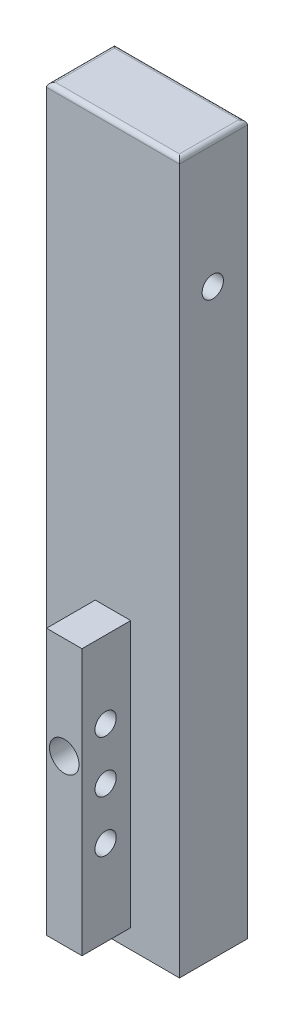
ISO-10303-21;
HEADER;
FILE_DESCRIPTION(('STEP AP214'),'2;1');
FILE_NAME('part.step','',(''),(''),'','','');
FILE_SCHEMA(('AUTOMOTIVE_DESIGN { 1 0 10303 214 1 1 1 1 }'));
ENDSEC;
DATA;
#1=APPLICATION_CONTEXT('core data for automotive mechanical design processes');
#2=APPLICATION_PROTOCOL_DEFINITION('international standard','automotive_design',2000,#1);
#3=PRODUCT_CONTEXT('',#1,'mechanical');
#4=PRODUCT('Part','Part','',(#3));
#5=PRODUCT_RELATED_PRODUCT_CATEGORY('part','',(#4));
#6=PRODUCT_DEFINITION_FORMATION('','',#4);
#7=PRODUCT_DEFINITION_CONTEXT('part definition',#1,'design');
#8=PRODUCT_DEFINITION('design','',#6,#7);
#9=PRODUCT_DEFINITION_SHAPE('','',#8);
#10=(LENGTH_UNIT() NAMED_UNIT(*) SI_UNIT(.MILLI.,.METRE.));
#11=(NAMED_UNIT(*) PLANE_ANGLE_UNIT() SI_UNIT($,.RADIAN.));
#12=(NAMED_UNIT(*) SI_UNIT($,.STERADIAN.) SOLID_ANGLE_UNIT());
#13=UNCERTAINTY_MEASURE_WITH_UNIT(LENGTH_MEASURE(1.E-05),#10,'distance_accuracy_value','');
#14=(GEOMETRIC_REPRESENTATION_CONTEXT(3) GLOBAL_UNCERTAINTY_ASSIGNED_CONTEXT((#13)) GLOBAL_UNIT_ASSIGNED_CONTEXT((#10,
#11,#12)) REPRESENTATION_CONTEXT('',''));
#15=CARTESIAN_POINT('',(0.,0.,0.));
#16=DIRECTION('',(0.,0.,1.));
#17=DIRECTION('',(1.,0.,0.));
#18=AXIS2_PLACEMENT_3D('',#15,#16,#17);
#19=CARTESIAN_POINT('',(22.5,68.3783783783784,0.));
#20=DIRECTION('',(0.,0.,-1.));
#21=DIRECTION('',(-1.,0.,0.));
#22=AXIS2_PLACEMENT_3D('',#19,#20,#21);
#23=PLANE('',#22);
#24=DIRECTION('',(0.,-1.,0.));
#25=VECTOR('',#24,1.);
#26=CARTESIAN_POINT('',(22.5,68.3783783783784,0.));
#27=LINE('',#26,#25);
#28=CARTESIAN_POINT('',(22.5,67.6283783783784,0.));
#29=VERTEX_POINT('',#28);
#30=CARTESIAN_POINT('',(22.5,-51.6216216216216,0.));
#31=VERTEX_POINT('',#30);
#32=EDGE_CURVE('E157',#29,#31,#27,.T.);
#33=ORIENTED_EDGE('',*,*,#32,.F.);
#34=DIRECTION('',(-1.,0.,0.));
#35=VECTOR('',#34,1.);
#36=CARTESIAN_POINT('',(22.5,67.6283783783784,0.));
#37=LINE('',#36,#35);
#38=CARTESIAN_POINT('',(0.,67.6283783783784,0.));
#39=VERTEX_POINT('',#38);
#40=EDGE_CURVE('E42',#29,#39,#37,.T.);
#41=ORIENTED_EDGE('',*,*,#40,.T.);
#42=DIRECTION('',(0.,-1.,0.));
#43=VECTOR('',#42,1.);
#44=CARTESIAN_POINT('',(0.,68.3783783783784,0.));
#45=LINE('',#44,#43);
#46=CARTESIAN_POINT('',(0.,-51.6216216216216,0.));
#47=VERTEX_POINT('',#46);
#48=EDGE_CURVE('E153',#39,#47,#45,.T.);
#49=ORIENTED_EDGE('',*,*,#48,.T.);
#50=DIRECTION('',(-1.,0.,0.));
#51=VECTOR('',#50,1.);
#52=CARTESIAN_POINT('',(22.5,-51.6216216216216,0.));
#53=LINE('',#52,#51);
#54=EDGE_CURVE('E172',#31,#47,#53,.T.);
#55=ORIENTED_EDGE('',*,*,#54,.F.);
#56=EDGE_LOOP('',(#33,#41,#49,#55));
#57=FACE_BOUND('',#56,.T.);
#58=DIRECTION('',(0.,-1.,0.));
#59=VECTOR('',#58,1.);
#60=CARTESIAN_POINT('',(14.25,-48.3716216216216,0.));
#61=LINE('',#60,#59);
#62=CARTESIAN_POINT('',(14.25,-3.37162162162163,0.));
#63=VERTEX_POINT('',#62);
#64=CARTESIAN_POINT('',(14.25,-48.3716216216216,0.));
#65=VERTEX_POINT('',#64);
#66=EDGE_CURVE('E128',#63,#65,#61,.T.);
#67=ORIENTED_EDGE('',*,*,#66,.T.);
#68=DIRECTION('',(-1.,0.,0.));
#69=VECTOR('',#68,1.);
#70=CARTESIAN_POINT('',(14.25,-48.3716216216216,0.));
#71=LINE('',#70,#69);
#72=CARTESIAN_POINT('',(8.25,-48.3716216216216,0.));
#73=VERTEX_POINT('',#72);
#74=EDGE_CURVE('E111',#65,#73,#71,.T.);
#75=ORIENTED_EDGE('',*,*,#74,.T.);
#76=DIRECTION('',(0.,-1.,0.));
#77=VECTOR('',#76,1.);
#78=CARTESIAN_POINT('',(8.25,-48.3716216216216,0.));
#79=LINE('',#78,#77);
#80=CARTESIAN_POINT('',(8.25,-3.37162162162163,0.));
#81=VERTEX_POINT('',#80);
#82=EDGE_CURVE('E146',#81,#73,#79,.T.);
#83=ORIENTED_EDGE('',*,*,#82,.F.);
#84=DIRECTION('',(-1.,0.,0.));
#85=VECTOR('',#84,1.);
#86=CARTESIAN_POINT('',(14.25,-3.37162162162163,0.));
#87=LINE('',#86,#85);
#88=EDGE_CURVE('E135',#63,#81,#87,.T.);
#89=ORIENTED_EDGE('',*,*,#88,.F.);
#90=EDGE_LOOP('',(#67,#75,#83,#89));
#91=FACE_BOUND('',#90,.T.);
#92=ADVANCED_FACE('F33',(#57,#91),#23,.F.);
#93=CARTESIAN_POINT('',(22.5,68.3783783783784,-11.5));
#94=DIRECTION('',(0.,-1.,0.));
#95=DIRECTION('',(0.,0.,-1.));
#96=AXIS2_PLACEMENT_3D('',#93,#94,#95);
#97=PLANE('',#96);
#98=DIRECTION('',(0.,0.,1.));
#99=VECTOR('',#98,1.);
#100=CARTESIAN_POINT('',(21.75,68.3783783783784,-11.5));
#101=LINE('',#100,#99);
#102=CARTESIAN_POINT('',(21.75,68.3783783783784,-0.75));
#103=VERTEX_POINT('',#102);
#104=CARTESIAN_POINT('',(21.75,68.3783783783784,-10.75));
#105=VERTEX_POINT('',#104);
#106=EDGE_CURVE('E252',#103,#105,#101,.F.);
#107=ORIENTED_EDGE('',*,*,#106,.T.);
#108=DIRECTION('',(-1.,0.,0.));
#109=VECTOR('',#108,1.);
#110=CARTESIAN_POINT('',(22.5,68.3783783783784,-10.75));
#111=LINE('',#110,#109);
#112=CARTESIAN_POINT('',(0.750000000000001,68.3783783783784,-10.75));
#113=VERTEX_POINT('',#112);
#114=EDGE_CURVE('E271',#105,#113,#111,.T.);
#115=ORIENTED_EDGE('',*,*,#114,.T.);
#116=DIRECTION('',(0.,0.,1.));
#117=VECTOR('',#116,1.);
#118=CARTESIAN_POINT('',(0.750000000000001,68.3783783783784,-11.5));
#119=LINE('',#118,#117);
#120=CARTESIAN_POINT('',(0.750000000000001,68.3783783783784,-0.75));
#121=VERTEX_POINT('',#120);
#122=EDGE_CURVE('E175',#113,#121,#119,.T.);
#123=ORIENTED_EDGE('',*,*,#122,.T.);
#124=DIRECTION('',(-1.,0.,0.));
#125=VECTOR('',#124,1.);
#126=CARTESIAN_POINT('',(22.5,68.3783783783784,-0.750000000000001));
#127=LINE('',#126,#125);
#128=EDGE_CURVE('E274',#121,#103,#127,.F.);
#129=ORIENTED_EDGE('',*,*,#128,.T.);
#130=EDGE_LOOP('',(#107,#115,#123,#129));
#131=FACE_BOUND('',#130,.T.);
#132=ADVANCED_FACE('F221',(#131),#97,.F.);
#133=CARTESIAN_POINT('',(22.5,-51.6216216216216,0.));
#134=DIRECTION('',(0.,1.,0.));
#135=DIRECTION('',(0.,0.,1.));
#136=AXIS2_PLACEMENT_3D('',#133,#134,#135);
#137=PLANE('',#136);
#138=DIRECTION('',(0.,0.,-1.));
#139=VECTOR('',#138,1.);
#140=CARTESIAN_POINT('',(0.,-51.6216216216216,0.));
#141=LINE('',#140,#139);
#142=CARTESIAN_POINT('',(0.,-51.6216216216216,-11.5));
#143=VERTEX_POINT('',#142);
#144=EDGE_CURVE('E166',#47,#143,#141,.T.);
#145=ORIENTED_EDGE('',*,*,#144,.T.);
#146=DIRECTION('',(-1.,0.,0.));
#147=VECTOR('',#146,1.);
#148=CARTESIAN_POINT('',(22.5,-51.6216216216216,-11.5));
#149=LINE('',#148,#147);
#150=CARTESIAN_POINT('',(22.5,-51.6216216216216,-11.5));
#151=VERTEX_POINT('',#150);
#152=EDGE_CURVE('E164',#151,#143,#149,.T.);
#153=ORIENTED_EDGE('',*,*,#152,.F.);
#154=DIRECTION('',(0.,0.,-1.));
#155=VECTOR('',#154,1.);
#156=CARTESIAN_POINT('',(22.5,-51.6216216216216,0.));
#157=LINE('',#156,#155);
#158=EDGE_CURVE('E159',#31,#151,#157,.T.);
#159=ORIENTED_EDGE('',*,*,#158,.F.);
#160=ORIENTED_EDGE('',*,*,#54,.T.);
#161=EDGE_LOOP('',(#145,#153,#159,#160));
#162=FACE_BOUND('',#161,.T.);
#163=ADVANCED_FACE('F227',(#162),#137,.F.);
#164=CARTESIAN_POINT('',(22.5,-51.6216216216216,-11.5));
#165=DIRECTION('',(0.,0.,1.));
#166=DIRECTION('',(1.,0.,0.));
#167=AXIS2_PLACEMENT_3D('',#164,#165,#166);
#168=PLANE('',#167);
#169=CARTESIAN_POINT('',(11.25,-20.6216216216216,-11.5));
#170=DIRECTION('',(0.,0.,-1.));
#171=DIRECTION('',(-1.,0.,0.));
#172=AXIS2_PLACEMENT_3D('',#169,#170,#171);
#173=CIRCLE('',#172,2.5);
#174=CARTESIAN_POINT('',(8.75,-20.6216216216216,-11.5));
#175=VERTEX_POINT('',#174);
#176=EDGE_CURVE('E254',#175,#175,#173,.T.);
#177=ORIENTED_EDGE('',*,*,#176,.F.);
#178=EDGE_LOOP('',(#177));
#179=FACE_BOUND('',#178,.T.);
#180=DIRECTION('',(0.,1.,0.));
#181=VECTOR('',#180,1.);
#182=CARTESIAN_POINT('',(0.,-51.6216216216216,-11.5));
#183=LINE('',#182,#181);
#184=CARTESIAN_POINT('',(0.,67.6283783783784,-11.5));
#185=VERTEX_POINT('',#184);
#186=EDGE_CURVE('E160',#143,#185,#183,.T.);
#187=ORIENTED_EDGE('',*,*,#186,.T.);
#188=DIRECTION('',(-1.,0.,0.));
#189=VECTOR('',#188,1.);
#190=CARTESIAN_POINT('',(22.5,67.6283783783784,-11.5));
#191=LINE('',#190,#189);
#192=CARTESIAN_POINT('',(22.5,67.6283783783784,-11.5));
#193=VERTEX_POINT('',#192);
#194=EDGE_CURVE('E269',#185,#193,#191,.F.);
#195=ORIENTED_EDGE('',*,*,#194,.T.);
#196=DIRECTION('',(0.,1.,0.));
#197=VECTOR('',#196,1.);
#198=CARTESIAN_POINT('',(22.5,-51.6216216216216,-11.5));
#199=LINE('',#198,#197);
#200=EDGE_CURVE('E162',#151,#193,#199,.T.);
#201=ORIENTED_EDGE('',*,*,#200,.F.);
#202=ORIENTED_EDGE('',*,*,#152,.T.);
#203=EDGE_LOOP('',(#187,#195,#201,#202));
#204=FACE_BOUND('',#203,.T.);
#205=ADVANCED_FACE('F283',(#179,#204),#168,.F.);
#206=CARTESIAN_POINT('',(22.5,0.,0.));
#207=DIRECTION('',(1.,0.,0.));
#208=DIRECTION('',(0.,0.,-1.));
#209=AXIS2_PLACEMENT_3D('',#206,#207,#208);
#210=PLANE('',#209);
#211=CARTESIAN_POINT('',(22.5,46.8783783783784,-5.625));
#212=DIRECTION('',(1.,0.,0.));
#213=DIRECTION('',(0.,0.,-1.));
#214=AXIS2_PLACEMENT_3D('',#211,#212,#213);
#215=CIRCLE('',#214,1.8);
#216=CARTESIAN_POINT('',(22.5,46.8783783783784,-7.425));
#217=VERTEX_POINT('',#216);
#218=EDGE_CURVE('E141',#217,#217,#215,.T.);
#219=ORIENTED_EDGE('',*,*,#218,.F.);
#220=EDGE_LOOP('',(#219));
#221=FACE_BOUND('',#220,.T.);
#222=ORIENTED_EDGE('',*,*,#200,.T.);
#223=DIRECTION('',(0.,0.,1.));
#224=VECTOR('',#223,1.);
#225=CARTESIAN_POINT('',(22.5,67.6283783783784,0.));
#226=LINE('',#225,#224);
#227=EDGE_CURVE('E57',#193,#29,#226,.T.);
#228=ORIENTED_EDGE('',*,*,#227,.T.);
#229=ORIENTED_EDGE('',*,*,#32,.T.);
#230=ORIENTED_EDGE('',*,*,#158,.T.);
#231=EDGE_LOOP('',(#222,#228,#229,#230));
#232=FACE_BOUND('',#231,.T.);
#233=ADVANCED_FACE('F289',(#221,#232),#210,.T.);
#234=CARTESIAN_POINT('',(0.,0.,0.));
#235=DIRECTION('',(1.,0.,0.));
#236=DIRECTION('',(0.,0.,-1.));
#237=AXIS2_PLACEMENT_3D('',#234,#235,#236);
#238=PLANE('',#237);
#239=CARTESIAN_POINT('',(0.,46.8783783783784,-5.625));
#240=DIRECTION('',(1.,0.,0.));
#241=DIRECTION('',(0.,0.,-1.));
#242=AXIS2_PLACEMENT_3D('',#239,#240,#241);
#243=CIRCLE('',#242,1.8);
#244=CARTESIAN_POINT('',(0.,46.8783783783784,-7.425));
#245=VERTEX_POINT('',#244);
#246=EDGE_CURVE('E148',#245,#245,#243,.T.);
#247=ORIENTED_EDGE('',*,*,#246,.T.);
#248=EDGE_LOOP('',(#247));
#249=FACE_BOUND('',#248,.T.);
#250=ORIENTED_EDGE('',*,*,#48,.F.);
#251=DIRECTION('',(0.,0.,1.));
#252=VECTOR('',#251,1.);
#253=CARTESIAN_POINT('',(0.,67.6283783783784,0.));
#254=LINE('',#253,#252);
#255=EDGE_CURVE('E11',#39,#185,#254,.F.);
#256=ORIENTED_EDGE('',*,*,#255,.T.);
#257=ORIENTED_EDGE('',*,*,#186,.F.);
#258=ORIENTED_EDGE('',*,*,#144,.F.);
#259=EDGE_LOOP('',(#250,#256,#257,#258));
#260=FACE_BOUND('',#259,.T.);
#261=ADVANCED_FACE('F279',(#249,#260),#238,.F.);
#262=CARTESIAN_POINT('',(14.25,-3.37162162162163,8.25));
#263=DIRECTION('',(0.,1.,0.));
#264=DIRECTION('',(0.,0.,1.));
#265=AXIS2_PLACEMENT_3D('',#262,#263,#264);
#266=PLANE('',#265);
#267=DIRECTION('',(0.,0.,-1.));
#268=VECTOR('',#267,1.);
#269=CARTESIAN_POINT('',(8.25,-3.37162162162163,8.25));
#270=LINE('',#269,#268);
#271=CARTESIAN_POINT('',(8.25,-3.37162162162163,8.25));
#272=VERTEX_POINT('',#271);
#273=EDGE_CURVE('E136',#272,#81,#270,.T.);
#274=ORIENTED_EDGE('',*,*,#273,.F.);
#275=DIRECTION('',(-1.,0.,0.));
#276=VECTOR('',#275,1.);
#277=CARTESIAN_POINT('',(14.25,-3.37162162162163,8.25));
#278=LINE('',#277,#276);
#279=CARTESIAN_POINT('',(14.25,-3.37162162162163,8.25));
#280=VERTEX_POINT('',#279);
#281=EDGE_CURVE('E154',#280,#272,#278,.T.);
#282=ORIENTED_EDGE('',*,*,#281,.F.);
#283=DIRECTION('',(0.,0.,-1.));
#284=VECTOR('',#283,1.);
#285=CARTESIAN_POINT('',(14.25,-3.37162162162163,8.25));
#286=LINE('',#285,#284);
#287=EDGE_CURVE('E122',#280,#63,#286,.T.);
#288=ORIENTED_EDGE('',*,*,#287,.T.);
#289=ORIENTED_EDGE('',*,*,#88,.T.);
#290=EDGE_LOOP('',(#274,#282,#288,#289));
#291=FACE_BOUND('',#290,.T.);
#292=ADVANCED_FACE('F297',(#291),#266,.T.);
#293=CARTESIAN_POINT('',(14.25,-48.3716216216216,8.25));
#294=DIRECTION('',(0.,0.,1.));
#295=DIRECTION('',(1.,0.,0.));
#296=AXIS2_PLACEMENT_3D('',#293,#294,#295);
#297=PLANE('',#296);
#298=CARTESIAN_POINT('',(11.25,-20.6216216216216,8.25));
#299=DIRECTION('',(0.,0.,1.));
#300=DIRECTION('',(1.,0.,0.));
#301=AXIS2_PLACEMENT_3D('',#298,#299,#300);
#302=CIRCLE('',#301,2.5);
#303=CARTESIAN_POINT('',(13.75,-20.6216216216216,8.25));
#304=VERTEX_POINT('',#303);
#305=EDGE_CURVE('E197',#304,#304,#302,.F.);
#306=ORIENTED_EDGE('',*,*,#305,.T.);
#307=EDGE_LOOP('',(#306));
#308=FACE_BOUND('',#307,.T.);
#309=DIRECTION('',(0.,1.,0.));
#310=VECTOR('',#309,1.);
#311=CARTESIAN_POINT('',(8.25,-48.3716216216216,8.25));
#312=LINE('',#311,#310);
#313=CARTESIAN_POINT('',(8.25,-48.3716216216216,8.25));
#314=VERTEX_POINT('',#313);
#315=EDGE_CURVE('E138',#314,#272,#312,.T.);
#316=ORIENTED_EDGE('',*,*,#315,.F.);
#317=DIRECTION('',(-1.,0.,0.));
#318=VECTOR('',#317,1.);
#319=CARTESIAN_POINT('',(14.25,-48.3716216216216,8.25));
#320=LINE('',#319,#318);
#321=CARTESIAN_POINT('',(14.25,-48.3716216216216,8.25));
#322=VERTEX_POINT('',#321);
#323=EDGE_CURVE('E121',#322,#314,#320,.T.);
#324=ORIENTED_EDGE('',*,*,#323,.F.);
#325=DIRECTION('',(0.,1.,0.));
#326=VECTOR('',#325,1.);
#327=CARTESIAN_POINT('',(14.25,-48.3716216216216,8.25));
#328=LINE('',#327,#326);
#329=EDGE_CURVE('E131',#322,#280,#328,.T.);
#330=ORIENTED_EDGE('',*,*,#329,.T.);
#331=ORIENTED_EDGE('',*,*,#281,.T.);
#332=EDGE_LOOP('',(#316,#324,#330,#331));
#333=FACE_BOUND('',#332,.T.);
#334=ADVANCED_FACE('F305',(#308,#333),#297,.T.);
#335=CARTESIAN_POINT('',(14.25,-48.3716216216216,0.));
#336=DIRECTION('',(0.,-1.,0.));
#337=DIRECTION('',(0.,0.,-1.));
#338=AXIS2_PLACEMENT_3D('',#335,#336,#337);
#339=PLANE('',#338);
#340=DIRECTION('',(0.,0.,1.));
#341=VECTOR('',#340,1.);
#342=CARTESIAN_POINT('',(8.25,-48.3716216216216,0.));
#343=LINE('',#342,#341);
#344=EDGE_CURVE('E116',#73,#314,#343,.T.);
#345=ORIENTED_EDGE('',*,*,#344,.F.);
#346=ORIENTED_EDGE('',*,*,#74,.F.);
#347=DIRECTION('',(0.,0.,1.));
#348=VECTOR('',#347,1.);
#349=CARTESIAN_POINT('',(14.25,-48.3716216216216,0.));
#350=LINE('',#349,#348);
#351=EDGE_CURVE('E114',#65,#322,#350,.T.);
#352=ORIENTED_EDGE('',*,*,#351,.T.);
#353=ORIENTED_EDGE('',*,*,#323,.T.);
#354=EDGE_LOOP('',(#345,#346,#352,#353));
#355=FACE_BOUND('',#354,.T.);
#356=ADVANCED_FACE('F113',(#355),#339,.T.);
#357=CARTESIAN_POINT('',(14.25,0.,0.));
#358=DIRECTION('',(-1.,0.,0.));
#359=DIRECTION('',(0.,0.,1.));
#360=AXIS2_PLACEMENT_3D('',#357,#358,#359);
#361=PLANE('',#360);
#362=CARTESIAN_POINT('',(14.25,-33.8716216216216,4.25));
#363=DIRECTION('',(-1.,0.,0.));
#364=DIRECTION('',(0.,0.,1.));
#365=AXIS2_PLACEMENT_3D('',#362,#363,#364);
#366=CIRCLE('',#365,1.8);
#367=CARTESIAN_POINT('',(14.25,-33.8716216216216,6.05));
#368=VERTEX_POINT('',#367);
#369=EDGE_CURVE('E190',#368,#368,#366,.T.);
#370=ORIENTED_EDGE('',*,*,#369,.T.);
#371=EDGE_LOOP('',(#370));
#372=FACE_BOUND('',#371,.T.);
#373=CARTESIAN_POINT('',(14.25,-25.1216216216216,4.25));
#374=DIRECTION('',(-1.,0.,0.));
#375=DIRECTION('',(0.,0.,1.));
#376=AXIS2_PLACEMENT_3D('',#373,#374,#375);
#377=CIRCLE('',#376,1.8);
#378=CARTESIAN_POINT('',(14.25,-25.1216216216216,6.05));
#379=VERTEX_POINT('',#378);
#380=EDGE_CURVE('E186',#379,#379,#377,.T.);
#381=ORIENTED_EDGE('',*,*,#380,.T.);
#382=EDGE_LOOP('',(#381));
#383=FACE_BOUND('',#382,.T.);
#384=CARTESIAN_POINT('',(14.25,-16.3716216216216,4.25));
#385=DIRECTION('',(-1.,0.,0.));
#386=DIRECTION('',(0.,0.,1.));
#387=AXIS2_PLACEMENT_3D('',#384,#385,#386);
#388=CIRCLE('',#387,1.8);
#389=CARTESIAN_POINT('',(14.25,-16.3716216216216,6.05));
#390=VERTEX_POINT('',#389);
#391=EDGE_CURVE('E181',#390,#390,#388,.T.);
#392=ORIENTED_EDGE('',*,*,#391,.T.);
#393=EDGE_LOOP('',(#392));
#394=FACE_BOUND('',#393,.T.);
#395=ORIENTED_EDGE('',*,*,#66,.F.);
#396=ORIENTED_EDGE('',*,*,#287,.F.);
#397=ORIENTED_EDGE('',*,*,#329,.F.);
#398=ORIENTED_EDGE('',*,*,#351,.F.);
#399=EDGE_LOOP('',(#395,#396,#397,#398));
#400=FACE_BOUND('',#399,.T.);
#401=ADVANCED_FACE('F126',(#372,#383,#394,#400),#361,.F.);
#402=CARTESIAN_POINT('',(8.25,0.,0.));
#403=DIRECTION('',(-1.,0.,0.));
#404=DIRECTION('',(0.,0.,1.));
#405=AXIS2_PLACEMENT_3D('',#402,#403,#404);
#406=PLANE('',#405);
#407=CARTESIAN_POINT('',(8.25,-33.8716216216216,4.25));
#408=DIRECTION('',(-1.,0.,0.));
#409=DIRECTION('',(0.,0.,1.));
#410=AXIS2_PLACEMENT_3D('',#407,#408,#409);
#411=CIRCLE('',#410,1.8);
#412=CARTESIAN_POINT('',(8.25,-33.8716216216216,6.05));
#413=VERTEX_POINT('',#412);
#414=EDGE_CURVE('E187',#413,#413,#411,.T.);
#415=ORIENTED_EDGE('',*,*,#414,.F.);
#416=EDGE_LOOP('',(#415));
#417=FACE_BOUND('',#416,.T.);
#418=CARTESIAN_POINT('',(8.25,-25.1216216216216,4.25));
#419=DIRECTION('',(-1.,0.,0.));
#420=DIRECTION('',(0.,0.,1.));
#421=AXIS2_PLACEMENT_3D('',#418,#419,#420);
#422=CIRCLE('',#421,1.8);
#423=CARTESIAN_POINT('',(8.25,-25.1216216216216,6.05));
#424=VERTEX_POINT('',#423);
#425=EDGE_CURVE('E183',#424,#424,#422,.T.);
#426=ORIENTED_EDGE('',*,*,#425,.F.);
#427=EDGE_LOOP('',(#426));
#428=FACE_BOUND('',#427,.T.);
#429=CARTESIAN_POINT('',(8.25,-16.3716216216216,4.25));
#430=DIRECTION('',(-1.,0.,0.));
#431=DIRECTION('',(0.,0.,1.));
#432=AXIS2_PLACEMENT_3D('',#429,#430,#431);
#433=CIRCLE('',#432,1.8);
#434=CARTESIAN_POINT('',(8.25,-16.3716216216216,6.05));
#435=VERTEX_POINT('',#434);
#436=EDGE_CURVE('E178',#435,#435,#433,.T.);
#437=ORIENTED_EDGE('',*,*,#436,.F.);
#438=EDGE_LOOP('',(#437));
#439=FACE_BOUND('',#438,.T.);
#440=ORIENTED_EDGE('',*,*,#82,.T.);
#441=ORIENTED_EDGE('',*,*,#344,.T.);
#442=ORIENTED_EDGE('',*,*,#315,.T.);
#443=ORIENTED_EDGE('',*,*,#273,.T.);
#444=EDGE_LOOP('',(#440,#441,#442,#443));
#445=FACE_BOUND('',#444,.T.);
#446=ADVANCED_FACE('F312',(#417,#428,#439,#445),#406,.T.);
#447=CARTESIAN_POINT('',(-7.5,46.8783783783784,-5.625));
#448=DIRECTION('',(1.,0.,0.));
#449=DIRECTION('',(0.,0.,-1.));
#450=AXIS2_PLACEMENT_3D('',#447,#448,#449);
#451=CYLINDRICAL_SURFACE('',#450,1.8);
#452=ORIENTED_EDGE('',*,*,#218,.T.);
#453=EDGE_LOOP('',(#452));
#454=FACE_BOUND('',#453,.T.);
#455=ORIENTED_EDGE('',*,*,#246,.F.);
#456=EDGE_LOOP('',(#455));
#457=FACE_BOUND('',#456,.T.);
#458=ADVANCED_FACE('F217',(#454,#457),#451,.F.);
#459=CARTESIAN_POINT('',(-7.5,-16.3716216216216,4.25));
#460=DIRECTION('',(1.,0.,0.));
#461=DIRECTION('',(0.,0.,-1.));
#462=AXIS2_PLACEMENT_3D('',#459,#460,#461);
#463=CYLINDRICAL_SURFACE('',#462,1.8);
#464=CARTESIAN_POINT('',(10.7525062814467,-18.1716216216216,4.25));
#465=CARTESIAN_POINT('',(10.7525056360388,-18.1716218581667,4.2288114336592));
#466=CARTESIAN_POINT('',(10.7543565130373,-18.1712437634639,4.20762648555739));
#467=CARTESIAN_POINT('',(10.761660442367,-18.1697778028146,4.16591744168161));
#468=CARTESIAN_POINT('',(10.7671132194868,-18.1686899910959,4.14539329554318));
#469=CARTESIAN_POINT('',(10.7813302202153,-18.1659342898839,4.10564437641084));
#470=CARTESIAN_POINT('',(10.7900849153934,-18.1642680706074,4.08641605045995));
#471=CARTESIAN_POINT('',(10.8105229582496,-18.1605309263653,4.04963562427837));
#472=CARTESIAN_POINT('',(10.822206959176,-18.1584599111512,4.03208389914447));
#473=CARTESIAN_POINT('',(10.8486830805542,-18.1540047922578,3.99817271387737));
#474=CARTESIAN_POINT('',(10.8635968825428,-18.1516104659134,3.98191007259835));
#475=CARTESIAN_POINT('',(10.8956511285058,-18.1468085649859,3.95176394421325));
#476=CARTESIAN_POINT('',(10.9127923890639,-18.144400985856,3.93788133397413));
#477=CARTESIAN_POINT('',(10.9513517586991,-18.1394377042491,3.91082206061791));
#478=CARTESIAN_POINT('',(10.9730327435792,-18.1369083663937,3.89801557233231));
#479=CARTESIAN_POINT('',(11.0180523342218,-18.1323017443537,3.87565278907026));
#480=CARTESIAN_POINT('',(11.0413919065308,-18.1302247266733,3.86609840835779));
#481=CARTESIAN_POINT('',(11.0927669899194,-18.1264192048699,3.84903387330588));
#482=CARTESIAN_POINT('',(11.120982795495,-18.1247892691536,3.84204309483615));
#483=CARTESIAN_POINT('',(11.1781751593147,-18.1224893550597,3.83228381709074));
#484=CARTESIAN_POINT('',(11.2071521145159,-18.1218198881336,3.82951756733429));
#485=CARTESIAN_POINT('',(11.2683109115206,-18.1214826415764,3.82811362140173));
#486=CARTESIAN_POINT('',(11.3005053347779,-18.1219291638581,3.82994711105609));
#487=CARTESIAN_POINT('',(11.3641620687148,-18.1240263503155,3.83878473158602));
#488=CARTESIAN_POINT('',(11.3956239156184,-18.1256777569752,3.84579205075435));
#489=CARTESIAN_POINT('',(11.4571620965529,-18.1300268025,3.86514805261195));
#490=CARTESIAN_POINT('',(11.487220734356,-18.1327350859575,3.87755123178982));
#491=CARTESIAN_POINT('',(11.5444086141581,-18.1388514672121,3.90775058390082));
#492=CARTESIAN_POINT('',(11.5715427863064,-18.1422583582054,3.92553748166819));
#493=CARTESIAN_POINT('',(11.6149547534537,-18.1483328066633,3.9609861549782));
#494=CARTESIAN_POINT('',(11.6322138488899,-18.1509600600679,3.97745845815778));
#495=CARTESIAN_POINT('',(11.6637740047069,-18.1560494632759,4.01306151115214));
#496=CARTESIAN_POINT('',(11.6780767343853,-18.1585117057184,4.03219075048187));
#497=CARTESIAN_POINT('',(11.7031598065075,-18.1630019452033,4.07286508481007));
#498=CARTESIAN_POINT('',(11.7139176057632,-18.1650271358542,4.0944245137707));
#499=CARTESIAN_POINT('',(11.731185595045,-18.1683505339909,4.13923960256038));
#500=CARTESIAN_POINT('',(11.7376984174638,-18.1696491919427,4.16249420121391));
#501=CARTESIAN_POINT('',(11.7456039537842,-18.1712357674266,4.20719490214865));
#502=CARTESIAN_POINT('',(11.7474890162484,-18.1716207141602,4.22855129855831));
#503=CARTESIAN_POINT('',(11.747498398712,-18.1716225242528,4.27126087616314));
#504=CARTESIAN_POINT('',(11.7456241304799,-18.1712396759474,4.29261405555479));
#505=CARTESIAN_POINT('',(11.7384183290098,-18.1697938049104,4.33350724839463));
#506=CARTESIAN_POINT('',(11.7332785543051,-18.1687685492909,4.35308296044817));
#507=CARTESIAN_POINT('',(11.7199591859329,-18.1661819345877,4.39112821403385));
#508=CARTESIAN_POINT('',(11.7117793554609,-18.1646205337417,4.40959766926411));
#509=CARTESIAN_POINT('',(11.6923191056215,-18.1610413846046,4.44575708965396));
#510=CARTESIAN_POINT('',(11.6809255461149,-18.1590075823654,4.46338426896747));
#511=CARTESIAN_POINT('',(11.6556309132284,-18.154715066496,4.49669921764506));
#512=CARTESIAN_POINT('',(11.6417289095219,-18.15245626956,4.51238626380603));
#513=CARTESIAN_POINT('',(11.6101708817723,-18.1476453176841,4.54327693153057));
#514=CARTESIAN_POINT('',(11.5922684732012,-18.1450887494035,4.55822759996231));
#515=CARTESIAN_POINT('',(11.5544642303979,-18.1401572358094,4.58536899437481));
#516=CARTESIAN_POINT('',(11.5345613611555,-18.137782385645,4.59755828093314));
#517=CARTESIAN_POINT('',(11.4901768648511,-18.1330711875995,4.62075102173853));
#518=CARTESIAN_POINT('',(11.4654550046047,-18.1307933767392,4.63130668107089));
#519=CARTESIAN_POINT('',(11.4146991676955,-18.1269225316195,4.64874580808147));
#520=CARTESIAN_POINT('',(11.3886644506899,-18.1253298886737,4.65562717783636));
#521=CARTESIAN_POINT('',(11.3322183921813,-18.1227933787641,4.66645359350693));
#522=CARTESIAN_POINT('',(11.3016981946501,-18.1219691064867,4.66986356286471));
#523=CARTESIAN_POINT('',(11.2404764051724,-18.1214520094569,4.67201223495639));
#524=CARTESIAN_POINT('',(11.2097747273602,-18.1217597717167,4.67074851416402));
#525=CARTESIAN_POINT('',(11.1468535389206,-18.1235390228295,4.66328212414506));
#526=CARTESIAN_POINT('',(11.1146747936469,-18.1250890644562,4.65674587005079));
#527=CARTESIAN_POINT('',(11.0519632124284,-18.1292795781126,4.63823742129473));
#528=CARTESIAN_POINT('',(11.0214308546651,-18.1319203650332,4.62626365675965));
#529=CARTESIAN_POINT('',(10.9644332232457,-18.1378265487789,4.59745749027225));
#530=CARTESIAN_POINT('',(10.937850120089,-18.1410605560578,4.58085371807325));
#531=CARTESIAN_POINT('',(10.8885395762766,-18.1477655502075,4.54271839741073));
#532=CARTESIAN_POINT('',(10.865803549731,-18.1512359844563,4.52119808106511));
#533=CARTESIAN_POINT('',(10.8313810146151,-18.1568760483799,4.48055774533772));
#534=CARTESIAN_POINT('',(10.8183996354604,-18.1591319237107,4.46253905547315));
#535=CARTESIAN_POINT('',(10.7955882519239,-18.1632391878521,4.42455744837711));
#536=CARTESIAN_POINT('',(10.7857564929004,-18.1650908016914,4.40459562177046));
#537=CARTESIAN_POINT('',(10.7694878087768,-18.1682199797437,4.3626408758208));
#538=CARTESIAN_POINT('',(10.7631517508708,-18.1694803446016,4.3406071800217));
#539=CARTESIAN_POINT('',(10.7546618755404,-18.171180932023,4.29571410965462));
#540=CARTESIAN_POINT('',(10.752506977613,-18.1716213664733,4.27285494996032));
#541=CARTESIAN_POINT('',(10.7525062814467,-18.1716216216216,4.25));
#542=B_SPLINE_CURVE_WITH_KNOTS('',3,(#464,#465,#466,#467,#468,#469,#470,#471,#472,#473,#474,
#475,#476,#477,#478,#479,#480,#481,#482,#483,#484,#485,#486,#487,#488,#489,#490,#491,#492,#493,
#494,#495,#496,#497,#498,#499,#500,#501,#502,#503,#504,#505,#506,#507,#508,#509,#510,#511,#512,
#513,#514,#515,#516,#517,#518,#519,#520,#521,#522,#523,#524,#525,#526,#527,#528,#529,#530,#531,
#532,#533,#534,#535,#536,#537,#538,#539,#540,#541),.UNSPECIFIED.,.T.,.F.,(4,2,2,2,2,2,2,2,2,2,2,
2,2,2,2,2,2,2,2,2,2,2,2,2,2,2,2,2,2,2,2,2,2,2,2,2,2,2,4),(0.,0.0634775161022577,
0.126950182618939,0.190241068708331,0.253546081522303,0.319871020557273,0.386220343200149,
0.461847631380159,0.537519358818262,0.624507425012726,0.711541795350101,0.807847528404817,
0.904212657968287,1.00157449934062,1.09876954963393,1.17048585883542,1.24216156248133,
1.31428464991099,1.38636296975126,1.45035683509649,1.514326672865,1.57484911664802,
1.63537627580639,1.69837922866864,1.76140559614815,1.83152288049502,1.90167663112731,
1.98229044573577,2.06295023963832,2.15472131288339,2.24653998037934,2.34467128181191,
2.44283093293642,2.53681028049157,2.6305770367612,2.69726747086579,2.76392068710527,
2.83240811988915,2.90087785166753),.UNSPECIFIED.);
#543=CARTESIAN_POINT('',(10.7525062814467,-18.1716216216216,4.25));
#544=VERTEX_POINT('',#543);
#545=EDGE_CURVE('E182',#544,#544,#542,.T.);
#546=ORIENTED_EDGE('',*,*,#545,.T.);
#547=EDGE_LOOP('',(#546));
#548=FACE_BOUND('',#547,.T.);
#549=ORIENTED_EDGE('',*,*,#436,.T.);
#550=EDGE_LOOP('',(#549));
#551=FACE_BOUND('',#550,.T.);
#552=ORIENTED_EDGE('',*,*,#391,.F.);
#553=EDGE_LOOP('',(#552));
#554=FACE_BOUND('',#553,.T.);
#555=ADVANCED_FACE('F199',(#548,#551,#554),#463,.F.);
#556=CARTESIAN_POINT('',(-7.5,-25.1216216216216,4.25));
#557=DIRECTION('',(1.,0.,0.));
#558=DIRECTION('',(0.,0.,-1.));
#559=AXIS2_PLACEMENT_3D('',#556,#557,#558);
#560=CYLINDRICAL_SURFACE('',#559,1.8);
#561=ORIENTED_EDGE('',*,*,#425,.T.);
#562=EDGE_LOOP('',(#561));
#563=FACE_BOUND('',#562,.T.);
#564=ORIENTED_EDGE('',*,*,#380,.F.);
#565=EDGE_LOOP('',(#564));
#566=FACE_BOUND('',#565,.T.);
#567=ADVANCED_FACE('F210',(#563,#566),#560,.F.);
#568=CARTESIAN_POINT('',(-7.5,-33.8716216216216,4.25));
#569=DIRECTION('',(1.,0.,0.));
#570=DIRECTION('',(0.,0.,-1.));
#571=AXIS2_PLACEMENT_3D('',#568,#569,#570);
#572=CYLINDRICAL_SURFACE('',#571,1.8);
#573=ORIENTED_EDGE('',*,*,#414,.T.);
#574=EDGE_LOOP('',(#573));
#575=FACE_BOUND('',#574,.T.);
#576=ORIENTED_EDGE('',*,*,#369,.F.);
#577=EDGE_LOOP('',(#576));
#578=FACE_BOUND('',#577,.T.);
#579=ADVANCED_FACE('F207',(#575,#578),#572,.F.);
#580=CARTESIAN_POINT('',(11.25,-20.6216216216216,15.3210678118655));
#581=DIRECTION('',(0.,0.,-1.));
#582=DIRECTION('',(-1.,0.,0.));
#583=AXIS2_PLACEMENT_3D('',#580,#581,#582);
#584=CYLINDRICAL_SURFACE('',#583,2.5);
#585=ORIENTED_EDGE('',*,*,#305,.F.);
#586=EDGE_LOOP('',(#585));
#587=FACE_BOUND('',#586,.T.);
#588=ORIENTED_EDGE('',*,*,#176,.T.);
#589=EDGE_LOOP('',(#588));
#590=FACE_BOUND('',#589,.T.);
#591=ORIENTED_EDGE('',*,*,#545,.F.);
#592=EDGE_LOOP('',(#591));
#593=FACE_BOUND('',#592,.T.);
#594=ADVANCED_FACE('F203',(#587,#590,#593),#584,.F.);
#595=CARTESIAN_POINT('',(22.5,67.6283783783784,-0.75));
#596=DIRECTION('',(-1.,0.,0.));
#597=DIRECTION('',(0.,0.,1.));
#598=AXIS2_PLACEMENT_3D('',#595,#596,#597);
#599=CYLINDRICAL_SURFACE('',#598,0.75);
#600=CARTESIAN_POINT('',(0.750000000000001,67.6283783783784,-0.75));
#601=DIRECTION('',(0.707106781186547,0.,0.707106781186547));
#602=DIRECTION('',(-0.707106781186547,0.,0.707106781186547));
#603=AXIS2_PLACEMENT_3D('',#600,#601,#602);
#604=ELLIPSE('',#603,1.06066017177982,0.75);
#605=EDGE_CURVE('E255',#39,#121,#604,.F.);
#606=ORIENTED_EDGE('',*,*,#605,.F.);
#607=ORIENTED_EDGE('',*,*,#40,.F.);
#608=CARTESIAN_POINT('',(21.75,67.6283783783784,-0.75));
#609=DIRECTION('',(-0.707106781186547,0.,0.707106781186547));
#610=DIRECTION('',(-0.707106781186547,0.,-0.707106781186547));
#611=AXIS2_PLACEMENT_3D('',#608,#609,#610);
#612=ELLIPSE('',#611,1.06066017177982,0.75);
#613=EDGE_CURVE('E37',#103,#29,#612,.F.);
#614=ORIENTED_EDGE('',*,*,#613,.F.);
#615=ORIENTED_EDGE('',*,*,#128,.F.);
#616=EDGE_LOOP('',(#606,#607,#614,#615));
#617=FACE_BOUND('',#616,.T.);
#618=ADVANCED_FACE('F35',(#617),#599,.T.);
#619=CARTESIAN_POINT('',(21.75,67.6283783783784,0.));
#620=DIRECTION('',(0.,0.,-1.));
#621=DIRECTION('',(-1.,0.,0.));
#622=AXIS2_PLACEMENT_3D('',#619,#620,#621);
#623=CYLINDRICAL_SURFACE('',#622,0.75);
#624=ORIENTED_EDGE('',*,*,#613,.T.);
#625=ORIENTED_EDGE('',*,*,#227,.F.);
#626=CARTESIAN_POINT('',(21.75,67.6283783783784,-10.75));
#627=DIRECTION('',(-0.707106781186547,0.,-0.707106781186547));
#628=DIRECTION('',(0.707106781186547,0.,-0.707106781186547));
#629=AXIS2_PLACEMENT_3D('',#626,#627,#628);
#630=ELLIPSE('',#629,1.06066017177982,0.75);
#631=EDGE_CURVE('E259',#105,#193,#630,.T.);
#632=ORIENTED_EDGE('',*,*,#631,.F.);
#633=ORIENTED_EDGE('',*,*,#106,.F.);
#634=EDGE_LOOP('',(#624,#625,#632,#633));
#635=FACE_BOUND('',#634,.T.);
#636=ADVANCED_FACE('F239',(#635),#623,.T.);
#637=CARTESIAN_POINT('',(0.750000000000001,67.6283783783784,-11.5));
#638=DIRECTION('',(0.,0.,1.));
#639=DIRECTION('',(1.,0.,0.));
#640=AXIS2_PLACEMENT_3D('',#637,#638,#639);
#641=CYLINDRICAL_SURFACE('',#640,0.75);
#642=ORIENTED_EDGE('',*,*,#605,.T.);
#643=ORIENTED_EDGE('',*,*,#122,.F.);
#644=CARTESIAN_POINT('',(0.750000000000001,67.6283783783784,-10.75));
#645=DIRECTION('',(-0.707106781186547,0.,0.707106781186547));
#646=DIRECTION('',(0.707106781186547,0.,0.707106781186547));
#647=AXIS2_PLACEMENT_3D('',#644,#645,#646);
#648=ELLIPSE('',#647,1.06066017177982,0.75);
#649=EDGE_CURVE('E263',#185,#113,#648,.F.);
#650=ORIENTED_EDGE('',*,*,#649,.F.);
#651=ORIENTED_EDGE('',*,*,#255,.F.);
#652=EDGE_LOOP('',(#642,#643,#650,#651));
#653=FACE_BOUND('',#652,.T.);
#654=ADVANCED_FACE('F236',(#653),#641,.T.);
#655=CARTESIAN_POINT('',(22.5,67.6283783783784,-10.75));
#656=DIRECTION('',(-1.,0.,0.));
#657=DIRECTION('',(0.,0.,1.));
#658=AXIS2_PLACEMENT_3D('',#655,#656,#657);
#659=CYLINDRICAL_SURFACE('',#658,0.75);
#660=ORIENTED_EDGE('',*,*,#631,.T.);
#661=ORIENTED_EDGE('',*,*,#194,.F.);
#662=ORIENTED_EDGE('',*,*,#649,.T.);
#663=ORIENTED_EDGE('',*,*,#114,.F.);
#664=EDGE_LOOP('',(#660,#661,#662,#663));
#665=FACE_BOUND('',#664,.T.);
#666=ADVANCED_FACE('F233',(#665),#659,.T.);
#667=CLOSED_SHELL('',(#92,#132,#163,#205,#233,#261,#292,#334,#356,#401,#446,#458,#555,#567,#579,
#594,#618,#636,#654,#666));
#668=MANIFOLD_SOLID_BREP('B2',#667);
#669=ADVANCED_BREP_SHAPE_REPRESENTATION('',(#18,#668),#14);
#670=SHAPE_DEFINITION_REPRESENTATION(#9,#669);
ENDSEC;
END-ISO-10303-21;
